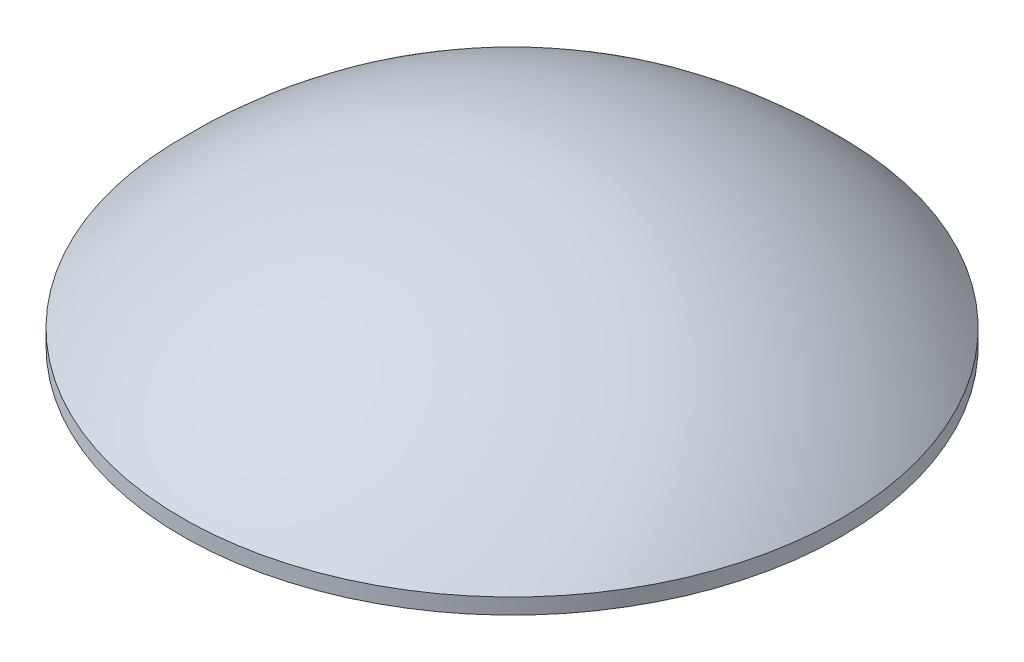
ISO-10303-21;
HEADER;
FILE_DESCRIPTION(('STEP AP214'),'2;1');
FILE_NAME('part.step','',(''),(''),'','','');
FILE_SCHEMA(('AUTOMOTIVE_DESIGN { 1 0 10303 214 1 1 1 1 }'));
ENDSEC;
DATA;
#1=APPLICATION_CONTEXT('core data for automotive mechanical design processes');
#2=APPLICATION_PROTOCOL_DEFINITION('international standard','automotive_design',2000,#1);
#3=PRODUCT_CONTEXT('',#1,'mechanical');
#4=PRODUCT('Part','Part','',(#3));
#5=PRODUCT_RELATED_PRODUCT_CATEGORY('part','',(#4));
#6=PRODUCT_DEFINITION_FORMATION('','',#4);
#7=PRODUCT_DEFINITION_CONTEXT('part definition',#1,'design');
#8=PRODUCT_DEFINITION('design','',#6,#7);
#9=PRODUCT_DEFINITION_SHAPE('','',#8);
#10=(LENGTH_UNIT() NAMED_UNIT(*) SI_UNIT(.MILLI.,.METRE.));
#11=(NAMED_UNIT(*) PLANE_ANGLE_UNIT() SI_UNIT($,.RADIAN.));
#12=(NAMED_UNIT(*) SI_UNIT($,.STERADIAN.) SOLID_ANGLE_UNIT());
#13=UNCERTAINTY_MEASURE_WITH_UNIT(LENGTH_MEASURE(1.E-05),#10,'distance_accuracy_value','');
#14=(GEOMETRIC_REPRESENTATION_CONTEXT(3) GLOBAL_UNCERTAINTY_ASSIGNED_CONTEXT((#13)) GLOBAL_UNIT_ASSIGNED_CONTEXT((#10,
#11,#12)) REPRESENTATION_CONTEXT('',''));
#15=CARTESIAN_POINT('',(0.,0.,0.));
#16=DIRECTION('',(0.,0.,1.));
#17=DIRECTION('',(1.,0.,0.));
#18=AXIS2_PLACEMENT_3D('',#15,#16,#17);
#19=CARTESIAN_POINT('',(0.,0.,0.));
#20=DIRECTION('',(0.,-1.,0.));
#21=DIRECTION('',(1.,0.,0.));
#22=AXIS2_PLACEMENT_3D('',#19,#20,#21);
#23=CYLINDRICAL_SURFACE('',#22,31.5);
#24=CARTESIAN_POINT('',(0.,1.49999999999999,0.));
#25=DIRECTION('',(0.,-1.,0.));
#26=DIRECTION('',(1.,0.,0.));
#27=AXIS2_PLACEMENT_3D('',#24,#25,#26);
#28=CIRCLE('',#27,31.5);
#29=CARTESIAN_POINT('',(31.5,1.5,0.));
#30=VERTEX_POINT('',#29);
#31=EDGE_CURVE('E10',#30,#30,#28,.T.);
#32=ORIENTED_EDGE('',*,*,#31,.T.);
#33=EDGE_LOOP('',(#32));
#34=FACE_BOUND('',#33,.T.);
#35=CARTESIAN_POINT('',(0.,0.,0.));
#36=DIRECTION('',(0.,-1.,0.));
#37=DIRECTION('',(1.,0.,0.));
#38=AXIS2_PLACEMENT_3D('',#35,#36,#37);
#39=CIRCLE('',#38,31.5);
#40=CARTESIAN_POINT('',(31.5,0.,0.));
#41=VERTEX_POINT('',#40);
#42=EDGE_CURVE('E39',#41,#41,#39,.T.);
#43=ORIENTED_EDGE('',*,*,#42,.F.);
#44=EDGE_LOOP('',(#43));
#45=FACE_BOUND('',#44,.T.);
#46=ADVANCED_FACE('F33',(#34,#45),#23,.T.);
#47=CARTESIAN_POINT('',(0.,-28.5,0.));
#48=DIRECTION('',(0.,-1.,0.));
#49=DIRECTION('',(1.,0.,0.));
#50=AXIS2_PLACEMENT_3D('',#47,#48,#49);
#51=SPHERICAL_SURFACE('',#50,43.5);
#52=ORIENTED_EDGE('',*,*,#31,.F.);
#53=EDGE_LOOP('',(#52));
#54=FACE_BOUND('',#53,.T.);
#55=ADVANCED_FACE('F48',(#54),#51,.T.);
#56=CARTESIAN_POINT('',(0.,0.,0.));
#57=DIRECTION('',(0.,-1.,0.));
#58=DIRECTION('',(1.,0.,0.));
#59=AXIS2_PLACEMENT_3D('',#56,#57,#58);
#60=PLANE('',#59);
#61=ORIENTED_EDGE('',*,*,#42,.T.);
#62=EDGE_LOOP('',(#61));
#63=FACE_BOUND('',#62,.T.);
#64=ADVANCED_FACE('F45',(#63),#60,.T.);
#65=CLOSED_SHELL('',(#46,#55,#64));
#66=MANIFOLD_SOLID_BREP('B2',#65);
#67=ADVANCED_BREP_SHAPE_REPRESENTATION('',(#18,#66),#14);
#68=SHAPE_DEFINITION_REPRESENTATION(#9,#67);
ENDSEC;
END-ISO-10303-21;
